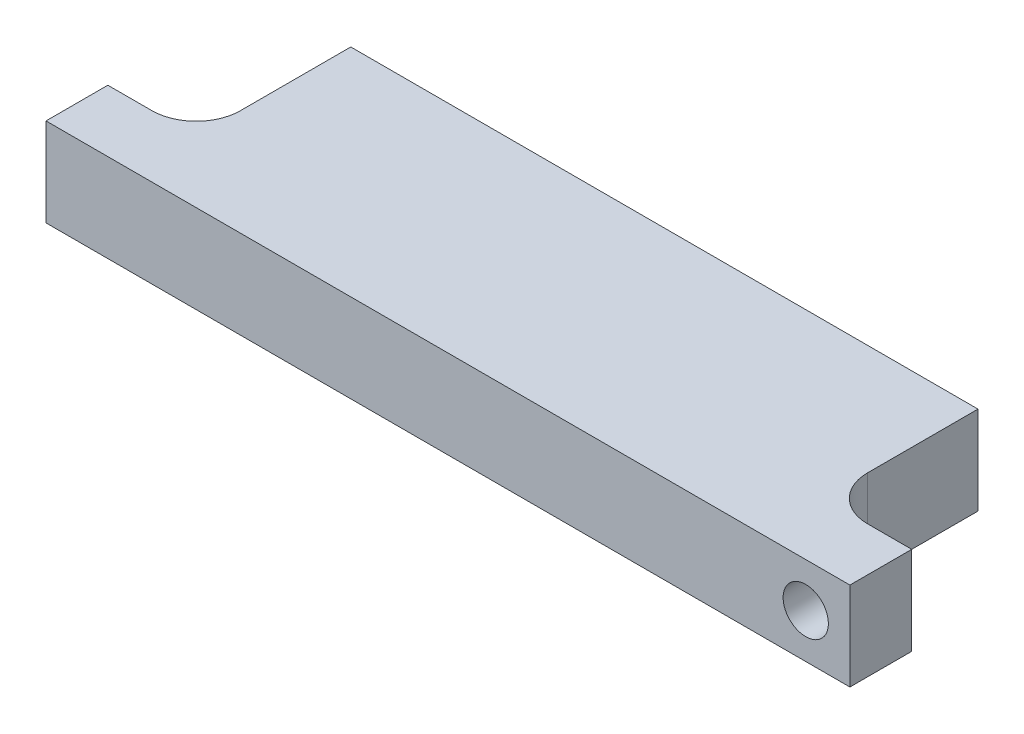
ISO-10303-21;
HEADER;
FILE_DESCRIPTION(('STEP AP214'),'2;1');
FILE_NAME('part.step','',(''),(''),'','','');
FILE_SCHEMA(('AUTOMOTIVE_DESIGN { 1 0 10303 214 1 1 1 1 }'));
ENDSEC;
DATA;
#1=APPLICATION_CONTEXT('core data for automotive mechanical design processes');
#2=APPLICATION_PROTOCOL_DEFINITION('international standard','automotive_design',2000,#1);
#3=PRODUCT_CONTEXT('',#1,'mechanical');
#4=PRODUCT('Part','Part','',(#3));
#5=PRODUCT_RELATED_PRODUCT_CATEGORY('part','',(#4));
#6=PRODUCT_DEFINITION_FORMATION('','',#4);
#7=PRODUCT_DEFINITION_CONTEXT('part definition',#1,'design');
#8=PRODUCT_DEFINITION('design','',#6,#7);
#9=PRODUCT_DEFINITION_SHAPE('','',#8);
#10=(LENGTH_UNIT() NAMED_UNIT(*) SI_UNIT(.MILLI.,.METRE.));
#11=(NAMED_UNIT(*) PLANE_ANGLE_UNIT() SI_UNIT($,.RADIAN.));
#12=(NAMED_UNIT(*) SI_UNIT($,.STERADIAN.) SOLID_ANGLE_UNIT());
#13=UNCERTAINTY_MEASURE_WITH_UNIT(LENGTH_MEASURE(1.E-05),#10,'distance_accuracy_value','');
#14=(GEOMETRIC_REPRESENTATION_CONTEXT(3) GLOBAL_UNCERTAINTY_ASSIGNED_CONTEXT((#13)) GLOBAL_UNIT_ASSIGNED_CONTEXT((#10,
#11,#12)) REPRESENTATION_CONTEXT('',''));
#15=CARTESIAN_POINT('',(0.,0.,0.));
#16=DIRECTION('',(0.,0.,1.));
#17=DIRECTION('',(1.,0.,0.));
#18=AXIS2_PLACEMENT_3D('',#15,#16,#17);
#19=CARTESIAN_POINT('',(18.2,0.,9.8));
#20=DIRECTION('',(1.,0.,0.));
#21=DIRECTION('',(0.,0.,-1.));
#22=AXIS2_PLACEMENT_3D('',#19,#20,#21);
#23=PLANE('',#22);
#24=DIRECTION('',(0.,-1.,0.));
#25=VECTOR('',#24,1.);
#26=CARTESIAN_POINT('',(18.2,4.,6.9999999993));
#27=LINE('',#26,#25);
#28=CARTESIAN_POINT('',(18.2,4.,6.9999999993));
#29=VERTEX_POINT('',#28);
#30=CARTESIAN_POINT('',(18.2,0.,6.9999999993));
#31=VERTEX_POINT('',#30);
#32=EDGE_CURVE('E149',#29,#31,#27,.T.);
#33=ORIENTED_EDGE('',*,*,#32,.F.);
#34=DIRECTION('',(0.,0.,-1.));
#35=VECTOR('',#34,1.);
#36=CARTESIAN_POINT('',(18.2,4.,9.8));
#37=LINE('',#36,#35);
#38=CARTESIAN_POINT('',(18.2,4.,9.8));
#39=VERTEX_POINT('',#38);
#40=EDGE_CURVE('E169',#39,#29,#37,.T.);
#41=ORIENTED_EDGE('',*,*,#40,.F.);
#42=DIRECTION('',(0.,1.,0.));
#43=VECTOR('',#42,1.);
#44=CARTESIAN_POINT('',(18.2,0.,9.8));
#45=LINE('',#44,#43);
#46=CARTESIAN_POINT('',(18.2,0.,9.8));
#47=VERTEX_POINT('',#46);
#48=EDGE_CURVE('E192',#47,#39,#45,.T.);
#49=ORIENTED_EDGE('',*,*,#48,.F.);
#50=DIRECTION('',(0.,0.,-1.));
#51=VECTOR('',#50,1.);
#52=CARTESIAN_POINT('',(18.2,0.,9.8));
#53=LINE('',#52,#51);
#54=EDGE_CURVE('E172',#47,#31,#53,.T.);
#55=ORIENTED_EDGE('',*,*,#54,.T.);
#56=EDGE_LOOP('',(#33,#41,#49,#55));
#57=FACE_BOUND('',#56,.T.);
#58=ADVANCED_FACE('F32',(#57),#23,.T.);
#59=CARTESIAN_POINT('',(-18.2,0.,9.8));
#60=DIRECTION('',(0.,0.,1.));
#61=DIRECTION('',(1.,0.,0.));
#62=AXIS2_PLACEMENT_3D('',#59,#60,#61);
#63=PLANE('',#62);
#64=CARTESIAN_POINT('',(16.2,2.,9.8));
#65=DIRECTION('',(0.,0.,1.));
#66=DIRECTION('',(1.,0.,0.));
#67=AXIS2_PLACEMENT_3D('',#64,#65,#66);
#68=CIRCLE('',#67,1.02499999999999);
#69=CARTESIAN_POINT('',(17.225,2.,9.8));
#70=VERTEX_POINT('',#69);
#71=EDGE_CURVE('E305',#70,#70,#68,.T.);
#72=ORIENTED_EDGE('',*,*,#71,.F.);
#73=EDGE_LOOP('',(#72));
#74=FACE_BOUND('',#73,.T.);
#75=DIRECTION('',(1.,0.,0.));
#76=VECTOR('',#75,1.);
#77=CARTESIAN_POINT('',(-18.2,4.,9.8));
#78=LINE('',#77,#76);
#79=CARTESIAN_POINT('',(-18.2,4.,9.8));
#80=VERTEX_POINT('',#79);
#81=EDGE_CURVE('E176',#80,#39,#78,.T.);
#82=ORIENTED_EDGE('',*,*,#81,.F.);
#83=DIRECTION('',(0.,1.,0.));
#84=VECTOR('',#83,1.);
#85=CARTESIAN_POINT('',(-18.2,0.,9.8));
#86=LINE('',#85,#84);
#87=CARTESIAN_POINT('',(-18.2,0.,9.8));
#88=VERTEX_POINT('',#87);
#89=EDGE_CURVE('E183',#88,#80,#86,.T.);
#90=ORIENTED_EDGE('',*,*,#89,.F.);
#91=DIRECTION('',(1.,0.,0.));
#92=VECTOR('',#91,1.);
#93=CARTESIAN_POINT('',(-18.2,0.,9.8));
#94=LINE('',#93,#92);
#95=EDGE_CURVE('E180',#88,#47,#94,.T.);
#96=ORIENTED_EDGE('',*,*,#95,.T.);
#97=ORIENTED_EDGE('',*,*,#48,.T.);
#98=EDGE_LOOP('',(#82,#90,#96,#97));
#99=FACE_BOUND('',#98,.T.);
#100=ADVANCED_FACE('F226',(#74,#99),#63,.T.);
#101=CARTESIAN_POINT('',(-18.2,0.,0.));
#102=DIRECTION('',(-1.,0.,0.));
#103=DIRECTION('',(0.,0.,1.));
#104=AXIS2_PLACEMENT_3D('',#101,#102,#103);
#105=PLANE('',#104);
#106=DIRECTION('',(0.,-1.,0.));
#107=VECTOR('',#106,1.);
#108=CARTESIAN_POINT('',(-18.2,4.,6.9999999993));
#109=LINE('',#108,#107);
#110=CARTESIAN_POINT('',(-18.2,4.,6.9999999993));
#111=VERTEX_POINT('',#110);
#112=CARTESIAN_POINT('',(-18.2,0.,6.9999999993));
#113=VERTEX_POINT('',#112);
#114=EDGE_CURVE('E163',#111,#113,#109,.T.);
#115=ORIENTED_EDGE('',*,*,#114,.T.);
#116=DIRECTION('',(0.,0.,1.));
#117=VECTOR('',#116,1.);
#118=CARTESIAN_POINT('',(-18.2,0.,0.));
#119=LINE('',#118,#117);
#120=EDGE_CURVE('E178',#113,#88,#119,.T.);
#121=ORIENTED_EDGE('',*,*,#120,.T.);
#122=ORIENTED_EDGE('',*,*,#89,.T.);
#123=DIRECTION('',(0.,0.,1.));
#124=VECTOR('',#123,1.);
#125=CARTESIAN_POINT('',(-18.2,4.,0.));
#126=LINE('',#125,#124);
#127=EDGE_CURVE('E188',#111,#80,#126,.T.);
#128=ORIENTED_EDGE('',*,*,#127,.F.);
#129=EDGE_LOOP('',(#115,#121,#122,#128));
#130=FACE_BOUND('',#129,.T.);
#131=ADVANCED_FACE('F232',(#130),#105,.T.);
#132=CARTESIAN_POINT('',(18.2,0.,0.));
#133=DIRECTION('',(0.,0.,-1.));
#134=DIRECTION('',(-1.,0.,0.));
#135=AXIS2_PLACEMENT_3D('',#132,#133,#134);
#136=PLANE('',#135);
#137=CARTESIAN_POINT('',(-10.,2.,0.));
#138=DIRECTION('',(0.,0.,-1.));
#139=DIRECTION('',(-1.,0.,0.));
#140=AXIS2_PLACEMENT_3D('',#137,#138,#139);
#141=CIRCLE('',#140,1.025);
#142=CARTESIAN_POINT('',(-11.025,2.,0.));
#143=VERTEX_POINT('',#142);
#144=EDGE_CURVE('E130',#143,#143,#141,.T.);
#145=ORIENTED_EDGE('',*,*,#144,.F.);
#146=EDGE_LOOP('',(#145));
#147=FACE_BOUND('',#146,.T.);
#148=CARTESIAN_POINT('',(10.,2.,0.));
#149=DIRECTION('',(0.,0.,-1.));
#150=DIRECTION('',(-1.,0.,0.));
#151=AXIS2_PLACEMENT_3D('',#148,#149,#150);
#152=CIRCLE('',#151,1.025);
#153=CARTESIAN_POINT('',(8.975,2.,0.));
#154=VERTEX_POINT('',#153);
#155=EDGE_CURVE('E129',#154,#154,#152,.T.);
#156=ORIENTED_EDGE('',*,*,#155,.F.);
#157=EDGE_LOOP('',(#156));
#158=FACE_BOUND('',#157,.T.);
#159=DIRECTION('',(0.,-1.,0.));
#160=VECTOR('',#159,1.);
#161=CARTESIAN_POINT('',(14.2,4.,0.));
#162=LINE('',#161,#160);
#163=CARTESIAN_POINT('',(14.2,4.,0.));
#164=VERTEX_POINT('',#163);
#165=CARTESIAN_POINT('',(14.2,0.,0.));
#166=VERTEX_POINT('',#165);
#167=EDGE_CURVE('E153',#164,#166,#162,.T.);
#168=ORIENTED_EDGE('',*,*,#167,.T.);
#169=DIRECTION('',(-1.,0.,0.));
#170=VECTOR('',#169,1.);
#171=CARTESIAN_POINT('',(18.2,0.,0.));
#172=LINE('',#171,#170);
#173=CARTESIAN_POINT('',(-14.2,0.,0.));
#174=VERTEX_POINT('',#173);
#175=EDGE_CURVE('E175',#166,#174,#172,.T.);
#176=ORIENTED_EDGE('',*,*,#175,.T.);
#177=DIRECTION('',(0.,-1.,0.));
#178=VECTOR('',#177,1.);
#179=CARTESIAN_POINT('',(-14.2,4.,0.));
#180=LINE('',#179,#178);
#181=CARTESIAN_POINT('',(-14.2,4.,0.));
#182=VERTEX_POINT('',#181);
#183=EDGE_CURVE('E166',#182,#174,#180,.T.);
#184=ORIENTED_EDGE('',*,*,#183,.F.);
#185=DIRECTION('',(-1.,0.,0.));
#186=VECTOR('',#185,1.);
#187=CARTESIAN_POINT('',(18.2,4.,0.));
#188=LINE('',#187,#186);
#189=EDGE_CURVE('E186',#164,#182,#188,.T.);
#190=ORIENTED_EDGE('',*,*,#189,.F.);
#191=EDGE_LOOP('',(#168,#176,#184,#190));
#192=FACE_BOUND('',#191,.T.);
#193=ADVANCED_FACE('F228',(#147,#158,#192),#136,.T.);
#194=CARTESIAN_POINT('',(0.,0.,0.));
#195=DIRECTION('',(0.,1.,0.));
#196=DIRECTION('',(0.,0.,1.));
#197=AXIS2_PLACEMENT_3D('',#194,#195,#196);
#198=PLANE('',#197);
#199=ORIENTED_EDGE('',*,*,#175,.F.);
#200=DIRECTION('',(0.,0.,-1.));
#201=VECTOR('',#200,1.);
#202=CARTESIAN_POINT('',(14.2,0.,6.9999999993));
#203=LINE('',#202,#201);
#204=CARTESIAN_POINT('',(14.2,0.,4.9999999993));
#205=VERTEX_POINT('',#204);
#206=EDGE_CURVE('E147',#205,#166,#203,.T.);
#207=ORIENTED_EDGE('',*,*,#206,.F.);
#208=CARTESIAN_POINT('',(16.2,0.,4.9999999993));
#209=DIRECTION('',(0.,1.,0.));
#210=DIRECTION('',(0.,0.,1.));
#211=AXIS2_PLACEMENT_3D('',#208,#209,#210);
#212=CIRCLE('',#211,2.);
#213=CARTESIAN_POINT('',(16.2,0.,6.9999999993));
#214=VERTEX_POINT('',#213);
#215=EDGE_CURVE('E207',#205,#214,#212,.T.);
#216=ORIENTED_EDGE('',*,*,#215,.T.);
#217=DIRECTION('',(-1.,0.,0.));
#218=VECTOR('',#217,1.);
#219=CARTESIAN_POINT('',(18.2,0.,6.9999999993));
#220=LINE('',#219,#218);
#221=EDGE_CURVE('E142',#31,#214,#220,.T.);
#222=ORIENTED_EDGE('',*,*,#221,.F.);
#223=ORIENTED_EDGE('',*,*,#54,.F.);
#224=ORIENTED_EDGE('',*,*,#95,.F.);
#225=ORIENTED_EDGE('',*,*,#120,.F.);
#226=DIRECTION('',(-1.,0.,0.));
#227=VECTOR('',#226,1.);
#228=CARTESIAN_POINT('',(-14.2,0.,6.9999999993));
#229=LINE('',#228,#227);
#230=CARTESIAN_POINT('',(-16.2,0.,6.9999999993));
#231=VERTEX_POINT('',#230);
#232=EDGE_CURVE('E161',#231,#113,#229,.T.);
#233=ORIENTED_EDGE('',*,*,#232,.F.);
#234=CARTESIAN_POINT('',(-16.2,0.,4.9999999993));
#235=DIRECTION('',(0.,1.,0.));
#236=DIRECTION('',(0.,0.,1.));
#237=AXIS2_PLACEMENT_3D('',#234,#235,#236);
#238=CIRCLE('',#237,2.);
#239=CARTESIAN_POINT('',(-14.2,0.,4.9999999993));
#240=VERTEX_POINT('',#239);
#241=EDGE_CURVE('E40',#231,#240,#238,.T.);
#242=ORIENTED_EDGE('',*,*,#241,.T.);
#243=DIRECTION('',(0.,0.,1.));
#244=VECTOR('',#243,1.);
#245=CARTESIAN_POINT('',(-14.2,0.,0.));
#246=LINE('',#245,#244);
#247=EDGE_CURVE('E156',#174,#240,#246,.T.);
#248=ORIENTED_EDGE('',*,*,#247,.F.);
#249=EDGE_LOOP('',(#199,#207,#216,#222,#223,#224,#225,#233,#242,#248));
#250=FACE_BOUND('',#249,.T.);
#251=ADVANCED_FACE('F231',(#250),#198,.F.);
#252=CARTESIAN_POINT('',(0.,4.,0.));
#253=DIRECTION('',(0.,1.,0.));
#254=DIRECTION('',(0.,0.,1.));
#255=AXIS2_PLACEMENT_3D('',#252,#253,#254);
#256=PLANE('',#255);
#257=DIRECTION('',(-1.,0.,0.));
#258=VECTOR('',#257,1.);
#259=CARTESIAN_POINT('',(18.2,4.,6.9999999993));
#260=LINE('',#259,#258);
#261=CARTESIAN_POINT('',(16.2,4.,6.9999999993));
#262=VERTEX_POINT('',#261);
#263=EDGE_CURVE('E143',#29,#262,#260,.T.);
#264=ORIENTED_EDGE('',*,*,#263,.T.);
#265=CARTESIAN_POINT('',(16.2,4.,4.9999999993));
#266=DIRECTION('',(0.,1.,0.));
#267=DIRECTION('',(0.,0.,1.));
#268=AXIS2_PLACEMENT_3D('',#265,#266,#267);
#269=CIRCLE('',#268,2.);
#270=CARTESIAN_POINT('',(14.2,4.,4.9999999993));
#271=VERTEX_POINT('',#270);
#272=EDGE_CURVE('E215',#262,#271,#269,.F.);
#273=ORIENTED_EDGE('',*,*,#272,.T.);
#274=DIRECTION('',(0.,0.,-1.));
#275=VECTOR('',#274,1.);
#276=CARTESIAN_POINT('',(14.2,4.,6.9999999993));
#277=LINE('',#276,#275);
#278=EDGE_CURVE('E146',#271,#164,#277,.T.);
#279=ORIENTED_EDGE('',*,*,#278,.T.);
#280=ORIENTED_EDGE('',*,*,#189,.T.);
#281=DIRECTION('',(0.,0.,1.));
#282=VECTOR('',#281,1.);
#283=CARTESIAN_POINT('',(-14.2,4.,0.));
#284=LINE('',#283,#282);
#285=CARTESIAN_POINT('',(-14.2,4.,4.9999999993));
#286=VERTEX_POINT('',#285);
#287=EDGE_CURVE('E158',#182,#286,#284,.T.);
#288=ORIENTED_EDGE('',*,*,#287,.T.);
#289=CARTESIAN_POINT('',(-16.2,4.,4.9999999993));
#290=DIRECTION('',(0.,1.,0.));
#291=DIRECTION('',(0.,0.,1.));
#292=AXIS2_PLACEMENT_3D('',#289,#290,#291);
#293=CIRCLE('',#292,2.);
#294=CARTESIAN_POINT('',(-16.2,4.,6.9999999993));
#295=VERTEX_POINT('',#294);
#296=EDGE_CURVE('E11',#286,#295,#293,.F.);
#297=ORIENTED_EDGE('',*,*,#296,.T.);
#298=DIRECTION('',(-1.,0.,0.));
#299=VECTOR('',#298,1.);
#300=CARTESIAN_POINT('',(-14.2,4.,6.9999999993));
#301=LINE('',#300,#299);
#302=EDGE_CURVE('E160',#295,#111,#301,.T.);
#303=ORIENTED_EDGE('',*,*,#302,.T.);
#304=ORIENTED_EDGE('',*,*,#127,.T.);
#305=ORIENTED_EDGE('',*,*,#81,.T.);
#306=ORIENTED_EDGE('',*,*,#40,.T.);
#307=EDGE_LOOP('',(#264,#273,#279,#280,#288,#297,#303,#304,#305,#306));
#308=FACE_BOUND('',#307,.T.);
#309=ADVANCED_FACE('F240',(#308),#256,.T.);
#310=CARTESIAN_POINT('',(-14.2,4.,0.));
#311=DIRECTION('',(1.,0.,0.));
#312=DIRECTION('',(0.,0.,-1.));
#313=AXIS2_PLACEMENT_3D('',#310,#311,#312);
#314=PLANE('',#313);
#315=ORIENTED_EDGE('',*,*,#247,.T.);
#316=DIRECTION('',(0.,-1.,0.));
#317=VECTOR('',#316,1.);
#318=CARTESIAN_POINT('',(-14.2,4.,4.9999999993));
#319=LINE('',#318,#317);
#320=EDGE_CURVE('E47',#240,#286,#319,.F.);
#321=ORIENTED_EDGE('',*,*,#320,.T.);
#322=ORIENTED_EDGE('',*,*,#287,.F.);
#323=ORIENTED_EDGE('',*,*,#183,.T.);
#324=EDGE_LOOP('',(#315,#321,#322,#323));
#325=FACE_BOUND('',#324,.T.);
#326=ADVANCED_FACE('F243',(#325),#314,.F.);
#327=CARTESIAN_POINT('',(-14.2,4.,6.9999999993));
#328=DIRECTION('',(0.,0.,1.));
#329=DIRECTION('',(1.,0.,0.));
#330=AXIS2_PLACEMENT_3D('',#327,#328,#329);
#331=PLANE('',#330);
#332=ORIENTED_EDGE('',*,*,#302,.F.);
#333=DIRECTION('',(0.,-1.,0.));
#334=VECTOR('',#333,1.);
#335=CARTESIAN_POINT('',(-16.2,0.,6.9999999993));
#336=LINE('',#335,#334);
#337=EDGE_CURVE('E203',#295,#231,#336,.T.);
#338=ORIENTED_EDGE('',*,*,#337,.T.);
#339=ORIENTED_EDGE('',*,*,#232,.T.);
#340=ORIENTED_EDGE('',*,*,#114,.F.);
#341=EDGE_LOOP('',(#332,#338,#339,#340));
#342=FACE_BOUND('',#341,.T.);
#343=ADVANCED_FACE('F249',(#342),#331,.F.);
#344=CARTESIAN_POINT('',(14.2,4.,6.9999999993));
#345=DIRECTION('',(-1.,0.,0.));
#346=DIRECTION('',(0.,0.,1.));
#347=AXIS2_PLACEMENT_3D('',#344,#345,#346);
#348=PLANE('',#347);
#349=ORIENTED_EDGE('',*,*,#278,.F.);
#350=DIRECTION('',(0.,-1.,0.));
#351=VECTOR('',#350,1.);
#352=CARTESIAN_POINT('',(14.2,0.,4.9999999993));
#353=LINE('',#352,#351);
#354=EDGE_CURVE('E194',#271,#205,#353,.T.);
#355=ORIENTED_EDGE('',*,*,#354,.T.);
#356=ORIENTED_EDGE('',*,*,#206,.T.);
#357=ORIENTED_EDGE('',*,*,#167,.F.);
#358=EDGE_LOOP('',(#349,#355,#356,#357));
#359=FACE_BOUND('',#358,.T.);
#360=ADVANCED_FACE('F252',(#359),#348,.F.);
#361=CARTESIAN_POINT('',(18.2,4.,6.9999999993));
#362=DIRECTION('',(0.,0.,1.));
#363=DIRECTION('',(1.,0.,0.));
#364=AXIS2_PLACEMENT_3D('',#361,#362,#363);
#365=PLANE('',#364);
#366=ORIENTED_EDGE('',*,*,#221,.T.);
#367=DIRECTION('',(0.,-1.,0.));
#368=VECTOR('',#367,1.);
#369=CARTESIAN_POINT('',(16.2,4.,6.9999999993));
#370=LINE('',#369,#368);
#371=CARTESIAN_POINT('',(16.2,0.975000000000008,6.9999999993));
#372=VERTEX_POINT('',#371);
#373=EDGE_CURVE('E201',#214,#372,#370,.F.);
#374=ORIENTED_EDGE('',*,*,#373,.T.);
#375=CARTESIAN_POINT('',(16.2,2.,6.9999999993));
#376=DIRECTION('',(0.,0.,1.));
#377=DIRECTION('',(1.,0.,0.));
#378=AXIS2_PLACEMENT_3D('',#375,#376,#377);
#379=CIRCLE('',#378,1.02499999999999);
#380=CARTESIAN_POINT('',(16.2,3.02499999999999,6.9999999993));
#381=VERTEX_POINT('',#380);
#382=EDGE_CURVE('E136',#372,#381,#379,.T.);
#383=ORIENTED_EDGE('',*,*,#382,.T.);
#384=DIRECTION('',(0.,-1.,0.));
#385=VECTOR('',#384,1.);
#386=CARTESIAN_POINT('',(16.2,4.,6.9999999993));
#387=LINE('',#386,#385);
#388=EDGE_CURVE('E199',#381,#262,#387,.F.);
#389=ORIENTED_EDGE('',*,*,#388,.T.);
#390=ORIENTED_EDGE('',*,*,#263,.F.);
#391=ORIENTED_EDGE('',*,*,#32,.T.);
#392=EDGE_LOOP('',(#366,#374,#383,#389,#390,#391));
#393=FACE_BOUND('',#392,.T.);
#394=ADVANCED_FACE('F254',(#393),#365,.F.);
#395=CARTESIAN_POINT('',(10.,2.,6.35));
#396=DIRECTION('',(0.,0.,-1.));
#397=DIRECTION('',(-1.,0.,0.));
#398=AXIS2_PLACEMENT_3D('',#395,#396,#397);
#399=CONICAL_SURFACE('',#398,1.025,1.02974425867665);
#400=CARTESIAN_POINT('',(10.,2.,6.96588213450325));
#401=VERTEX_POINT('',#400);
#402=VERTEX_LOOP('',#401);
#403=FACE_BOUND('',#402,.T.);
#404=CARTESIAN_POINT('',(10.,2.,6.35));
#405=DIRECTION('',(0.,0.,-1.));
#406=DIRECTION('',(-1.,0.,0.));
#407=AXIS2_PLACEMENT_3D('',#404,#405,#406);
#408=CIRCLE('',#407,1.025);
#409=CARTESIAN_POINT('',(8.975,2.,6.35));
#410=VERTEX_POINT('',#409);
#411=EDGE_CURVE('E133',#410,#410,#408,.T.);
#412=ORIENTED_EDGE('',*,*,#411,.T.);
#413=EDGE_LOOP('',(#412));
#414=FACE_BOUND('',#413,.T.);
#415=ADVANCED_FACE('F257',(#403,#414),#399,.F.);
#416=CARTESIAN_POINT('',(10.,2.,0.));
#417=DIRECTION('',(0.,0.,-1.));
#418=DIRECTION('',(-1.,0.,0.));
#419=AXIS2_PLACEMENT_3D('',#416,#417,#418);
#420=CYLINDRICAL_SURFACE('',#419,1.025);
#421=ORIENTED_EDGE('',*,*,#411,.F.);
#422=EDGE_LOOP('',(#421));
#423=FACE_BOUND('',#422,.T.);
#424=ORIENTED_EDGE('',*,*,#155,.T.);
#425=EDGE_LOOP('',(#424));
#426=FACE_BOUND('',#425,.T.);
#427=ADVANCED_FACE('F123',(#423,#426),#420,.F.);
#428=CARTESIAN_POINT('',(-10.,2.,6.35));
#429=DIRECTION('',(0.,0.,-1.));
#430=DIRECTION('',(-1.,0.,0.));
#431=AXIS2_PLACEMENT_3D('',#428,#429,#430);
#432=CONICAL_SURFACE('',#431,1.025,1.02974425867665);
#433=CARTESIAN_POINT('',(-10.,2.,6.96588213450325));
#434=VERTEX_POINT('',#433);
#435=VERTEX_LOOP('',#434);
#436=FACE_BOUND('',#435,.T.);
#437=CARTESIAN_POINT('',(-10.,2.,6.35));
#438=DIRECTION('',(0.,0.,-1.));
#439=DIRECTION('',(-1.,0.,0.));
#440=AXIS2_PLACEMENT_3D('',#437,#438,#439);
#441=CIRCLE('',#440,1.025);
#442=CARTESIAN_POINT('',(-11.025,2.,6.35));
#443=VERTEX_POINT('',#442);
#444=EDGE_CURVE('E127',#443,#443,#441,.T.);
#445=ORIENTED_EDGE('',*,*,#444,.T.);
#446=EDGE_LOOP('',(#445));
#447=FACE_BOUND('',#446,.T.);
#448=ADVANCED_FACE('F119',(#436,#447),#432,.F.);
#449=CARTESIAN_POINT('',(-10.,2.,0.));
#450=DIRECTION('',(0.,0.,-1.));
#451=DIRECTION('',(-1.,0.,0.));
#452=AXIS2_PLACEMENT_3D('',#449,#450,#451);
#453=CYLINDRICAL_SURFACE('',#452,1.025);
#454=ORIENTED_EDGE('',*,*,#444,.F.);
#455=EDGE_LOOP('',(#454));
#456=FACE_BOUND('',#455,.T.);
#457=ORIENTED_EDGE('',*,*,#144,.T.);
#458=EDGE_LOOP('',(#457));
#459=FACE_BOUND('',#458,.T.);
#460=ADVANCED_FACE('F122',(#456,#459),#453,.F.);
#461=CARTESIAN_POINT('',(16.2,2.,9.8));
#462=DIRECTION('',(0.,0.,1.));
#463=DIRECTION('',(1.,0.,0.));
#464=AXIS2_PLACEMENT_3D('',#461,#462,#463);
#465=CYLINDRICAL_SURFACE('',#464,1.02499999999999);
#466=ORIENTED_EDGE('',*,*,#382,.F.);
#467=CARTESIAN_POINT('',(16.2,0.975000000000008,6.9999999993));
#468=CARTESIAN_POINT('',(16.1730176236515,0.974998502318077,7.0000028059254));
#469=CARTESIAN_POINT('',(16.146049652455,0.97606617112265,6.99945336371676));
#470=CARTESIAN_POINT('',(16.0923352102757,0.980314356583435,6.99728036993252));
#471=CARTESIAN_POINT('',(16.0655886520774,0.98349399688609,6.9956572638703));
#472=CARTESIAN_POINT('',(15.9862292081621,0.996117420916341,6.98924596091265));
#473=CARTESIAN_POINT('',(15.9341949722901,1.00864637039432,6.98291508176033));
#474=CARTESIAN_POINT('',(15.8332986965553,1.04137010945497,6.96676031154823));
#475=CARTESIAN_POINT('',(15.7844329267387,1.06155568641268,6.95694061920214));
#476=CARTESIAN_POINT('',(15.6907966765325,1.10888160082206,6.93469139278945));
#477=CARTESIAN_POINT('',(15.646030473131,1.13602909179234,6.92225917668452));
#478=CARTESIAN_POINT('',(15.5588067114429,1.19840901054889,6.89501649392651));
#479=CARTESIAN_POINT('',(15.5166651967092,1.23403884492825,6.88010627741203));
#480=CARTESIAN_POINT('',(15.4386638404945,1.31151080774043,6.84989718228691));
#481=CARTESIAN_POINT('',(15.4028083962916,1.35335724735472,6.83459804011054));
#482=CARTESIAN_POINT('',(15.3354178676546,1.446214262713,6.8038792111672));
#483=CARTESIAN_POINT('',(15.3044841365314,1.49769625678285,6.78855391654737));
#484=CARTESIAN_POINT('',(15.2518444107104,1.6059915293526,6.76121728132874));
#485=CARTESIAN_POINT('',(15.2301313740185,1.66280069877349,6.74920341420889));
#486=CARTESIAN_POINT('',(15.19799996532,1.77662083529841,6.73098834794641));
#487=CARTESIAN_POINT('',(15.1869729987777,1.83340776394632,6.72447707140315));
#488=CARTESIAN_POINT('',(15.174675102115,1.94836860629842,6.71719715963563));
#489=CARTESIAN_POINT('',(15.1733938348087,2.00654098472616,6.71642243971448));
#490=CARTESIAN_POINT('',(15.1801789175024,2.11465198566577,6.72045666012025));
#491=CARTESIAN_POINT('',(15.1870767718484,2.16469656971338,6.72456776866188));
#492=CARTESIAN_POINT('',(15.2079891879185,2.26278383323789,6.73668048731513));
#493=CARTESIAN_POINT('',(15.2220060620468,2.31082585675186,6.74468336151632));
#494=CARTESIAN_POINT('',(15.2570012857074,2.40491757188241,6.7638472822494));
#495=CARTESIAN_POINT('',(15.2781330852064,2.45089552523873,6.77507706489185));
#496=CARTESIAN_POINT('',(15.3266386687792,2.53887997818272,6.79943766216175));
#497=CARTESIAN_POINT('',(15.3540154372883,2.5808845652993,6.81256938461654));
#498=CARTESIAN_POINT('',(15.4185083467556,2.66565697194004,6.8413792027355));
#499=CARTESIAN_POINT('',(15.4564381432586,2.70777214422452,6.85716265555938));
#500=CARTESIAN_POINT('',(15.5388711002864,2.78532660667871,6.88808017749256));
#501=CARTESIAN_POINT('',(15.5833780746199,2.82076199623227,6.90321386321626));
#502=CARTESIAN_POINT('',(15.6805840300941,2.88567474537296,6.93207284084944));
#503=CARTESIAN_POINT('',(15.7335871476989,2.91475050497573,6.94568522188719));
#504=CARTESIAN_POINT('',(15.8445727435402,2.9633013796315,6.96897681668549));
#505=CARTESIAN_POINT('',(15.9025457793983,2.98279424652157,6.97866329709228));
#506=CARTESIAN_POINT('',(16.0007945837696,3.00624621721084,6.9904377917433));
#507=CARTESIAN_POINT('',(16.0401903018414,3.0132519481087,6.9939976714807));
#508=CARTESIAN_POINT('',(16.1197114620181,3.02263922209009,6.998789935374));
#509=CARTESIAN_POINT('',(16.1598376856653,3.02501547829052,7.00001965843558));
#510=CARTESIAN_POINT('',(16.2,3.02499999999999,6.9999999993));
#511=B_SPLINE_CURVE_WITH_KNOTS('',3,(#467,#468,#469,#470,#471,#472,#473,#474,#475,#476,#477,
#478,#479,#480,#481,#482,#483,#484,#485,#486,#487,#488,#489,#490,#491,#492,#493,#494,#495,#496,
#497,#498,#499,#500,#501,#502,#503,#504,#505,#506,#507,#508,#509,#510),.UNSPECIFIED.,.F.,.F.,(4,
2,2,2,2,2,2,2,2,2,2,2,2,2,2,2,2,2,2,2,2,4),(0.,0.0808925942168758,0.161751643348836,
0.322577533242824,0.483210524537692,0.644009235727357,0.814794361352051,0.985698483244591,
1.17071692478431,1.35559380950526,1.52918434606133,1.70259073080401,1.85393579786659,
2.00533005638993,2.16022438606892,2.31519289452864,2.49093731111021,2.6667840367446,
2.85170110243421,3.03627431532808,3.15647022342626,3.2768033155726),.UNSPECIFIED.);
#512=EDGE_CURVE('E209',#372,#381,#511,.T.);
#513=ORIENTED_EDGE('',*,*,#512,.T.);
#514=EDGE_LOOP('',(#466,#513));
#515=FACE_BOUND('',#514,.T.);
#516=ORIENTED_EDGE('',*,*,#71,.T.);
#517=EDGE_LOOP('',(#516));
#518=FACE_BOUND('',#517,.T.);
#519=ADVANCED_FACE('F216',(#515,#518),#465,.F.);
#520=CARTESIAN_POINT('',(16.2,4.,4.9999999993));
#521=DIRECTION('',(0.,1.,0.));
#522=DIRECTION('',(0.,0.,1.));
#523=AXIS2_PLACEMENT_3D('',#520,#521,#522);
#524=CYLINDRICAL_SURFACE('',#523,2.);
#525=ORIENTED_EDGE('',*,*,#512,.F.);
#526=ORIENTED_EDGE('',*,*,#373,.F.);
#527=ORIENTED_EDGE('',*,*,#215,.F.);
#528=ORIENTED_EDGE('',*,*,#354,.F.);
#529=ORIENTED_EDGE('',*,*,#272,.F.);
#530=ORIENTED_EDGE('',*,*,#388,.F.);
#531=EDGE_LOOP('',(#525,#526,#527,#528,#529,#530));
#532=FACE_BOUND('',#531,.T.);
#533=ADVANCED_FACE('F219',(#532),#524,.F.);
#534=CARTESIAN_POINT('',(-16.2,4.,4.9999999993));
#535=DIRECTION('',(0.,1.,0.));
#536=DIRECTION('',(0.,0.,1.));
#537=AXIS2_PLACEMENT_3D('',#534,#535,#536);
#538=CYLINDRICAL_SURFACE('',#537,2.);
#539=ORIENTED_EDGE('',*,*,#296,.F.);
#540=ORIENTED_EDGE('',*,*,#320,.F.);
#541=ORIENTED_EDGE('',*,*,#241,.F.);
#542=ORIENTED_EDGE('',*,*,#337,.F.);
#543=EDGE_LOOP('',(#539,#540,#541,#542));
#544=FACE_BOUND('',#543,.T.);
#545=ADVANCED_FACE('F34',(#544),#538,.F.);
#546=CLOSED_SHELL('',(#58,#100,#131,#193,#251,#309,#326,#343,#360,#394,#415,#427,#448,#460,#519,
#533,#545));
#547=MANIFOLD_SOLID_BREP('B2',#546);
#548=ADVANCED_BREP_SHAPE_REPRESENTATION('',(#18,#547),#14);
#549=SHAPE_DEFINITION_REPRESENTATION(#9,#548);
ENDSEC;
END-ISO-10303-21;
